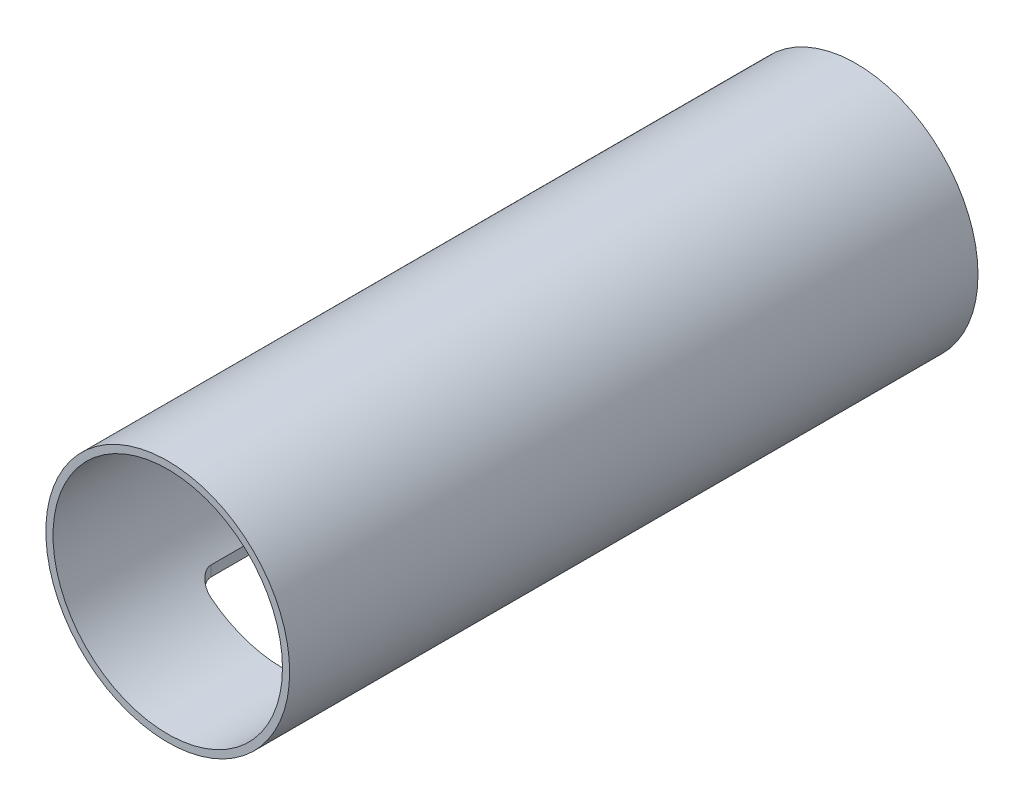
ISO-10303-21;
HEADER;
FILE_DESCRIPTION(('STEP AP214'),'2;1');
FILE_NAME('part.step','',(''),(''),'','','');
FILE_SCHEMA(('AUTOMOTIVE_DESIGN { 1 0 10303 214 1 1 1 1 }'));
ENDSEC;
DATA;
#1=APPLICATION_CONTEXT('core data for automotive mechanical design processes');
#2=APPLICATION_PROTOCOL_DEFINITION('international standard','automotive_design',2000,#1);
#3=PRODUCT_CONTEXT('',#1,'mechanical');
#4=PRODUCT('Part','Part','',(#3));
#5=PRODUCT_RELATED_PRODUCT_CATEGORY('part','',(#4));
#6=PRODUCT_DEFINITION_FORMATION('','',#4);
#7=PRODUCT_DEFINITION_CONTEXT('part definition',#1,'design');
#8=PRODUCT_DEFINITION('design','',#6,#7);
#9=PRODUCT_DEFINITION_SHAPE('','',#8);
#10=(LENGTH_UNIT() NAMED_UNIT(*) SI_UNIT(.MILLI.,.METRE.));
#11=(NAMED_UNIT(*) PLANE_ANGLE_UNIT() SI_UNIT($,.RADIAN.));
#12=(NAMED_UNIT(*) SI_UNIT($,.STERADIAN.) SOLID_ANGLE_UNIT());
#13=UNCERTAINTY_MEASURE_WITH_UNIT(LENGTH_MEASURE(1.E-05),#10,'distance_accuracy_value','');
#14=(GEOMETRIC_REPRESENTATION_CONTEXT(3) GLOBAL_UNCERTAINTY_ASSIGNED_CONTEXT((#13)) GLOBAL_UNIT_ASSIGNED_CONTEXT((#10,
#11,#12)) REPRESENTATION_CONTEXT('',''));
#15=CARTESIAN_POINT('',(0.,0.,0.));
#16=DIRECTION('',(0.,0.,1.));
#17=DIRECTION('',(1.,0.,0.));
#18=AXIS2_PLACEMENT_3D('',#15,#16,#17);
#19=CARTESIAN_POINT('',(0.,0.,304.8));
#20=DIRECTION('',(0.,0.,1.));
#21=DIRECTION('',(1.,0.,0.));
#22=AXIS2_PLACEMENT_3D('',#19,#20,#21);
#23=PLANE('',#22);
#24=CARTESIAN_POINT('',(0.,0.,304.8));
#25=DIRECTION('',(0.,0.,1.));
#26=DIRECTION('',(1.,0.,0.));
#27=AXIS2_PLACEMENT_3D('',#24,#25,#26);
#28=CIRCLE('',#27,53.975);
#29=CARTESIAN_POINT('',(53.975,0.,304.8));
#30=VERTEX_POINT('',#29);
#31=EDGE_CURVE('E138',#30,#30,#28,.T.);
#32=ORIENTED_EDGE('',*,*,#31,.T.);
#33=EDGE_LOOP('',(#32));
#34=FACE_BOUND('',#33,.T.);
#35=CARTESIAN_POINT('',(0.,0.,304.8));
#36=DIRECTION('',(0.,0.,1.));
#37=DIRECTION('',(1.,0.,0.));
#38=AXIS2_PLACEMENT_3D('',#35,#36,#37);
#39=CIRCLE('',#38,50.8);
#40=CARTESIAN_POINT('',(50.8,0.,304.8));
#41=VERTEX_POINT('',#40);
#42=EDGE_CURVE('E222',#41,#41,#39,.T.);
#43=ORIENTED_EDGE('',*,*,#42,.F.);
#44=EDGE_LOOP('',(#43));
#45=FACE_BOUND('',#44,.T.);
#46=ADVANCED_FACE('F34',(#34,#45),#23,.T.);
#47=CARTESIAN_POINT('',(0.,0.,0.));
#48=DIRECTION('',(0.,0.,1.));
#49=DIRECTION('',(1.,0.,0.));
#50=AXIS2_PLACEMENT_3D('',#47,#48,#49);
#51=PLANE('',#50);
#52=CARTESIAN_POINT('',(0.,0.,0.));
#53=DIRECTION('',(0.,0.,1.));
#54=DIRECTION('',(1.,0.,0.));
#55=AXIS2_PLACEMENT_3D('',#52,#53,#54);
#56=CIRCLE('',#55,53.975);
#57=CARTESIAN_POINT('',(53.975,0.,0.));
#58=VERTEX_POINT('',#57);
#59=EDGE_CURVE('E223',#58,#58,#56,.T.);
#60=ORIENTED_EDGE('',*,*,#59,.F.);
#61=EDGE_LOOP('',(#60));
#62=FACE_BOUND('',#61,.T.);
#63=CARTESIAN_POINT('',(0.,0.,0.));
#64=DIRECTION('',(0.,0.,1.));
#65=DIRECTION('',(1.,0.,0.));
#66=AXIS2_PLACEMENT_3D('',#63,#64,#65);
#67=CIRCLE('',#66,50.8);
#68=CARTESIAN_POINT('',(50.8,0.,0.));
#69=VERTEX_POINT('',#68);
#70=EDGE_CURVE('E224',#69,#69,#67,.T.);
#71=ORIENTED_EDGE('',*,*,#70,.T.);
#72=EDGE_LOOP('',(#71));
#73=FACE_BOUND('',#72,.T.);
#74=ADVANCED_FACE('F211',(#62,#73),#51,.F.);
#75=CARTESIAN_POINT('',(0.,0.,304.8));
#76=DIRECTION('',(0.,0.,-1.));
#77=DIRECTION('',(-1.,0.,0.));
#78=AXIS2_PLACEMENT_3D('',#75,#76,#77);
#79=CYLINDRICAL_SURFACE('',#78,53.975);
#80=CARTESIAN_POINT('',(0.,0.,50.8000000000001));
#81=DIRECTION('',(0.,0.,-1.));
#82=DIRECTION('',(-1.,0.,0.));
#83=AXIS2_PLACEMENT_3D('',#80,#81,#82);
#84=CIRCLE('',#83,53.975);
#85=CARTESIAN_POINT('',(31.75,-43.6490334944544,50.8000000000001));
#86=VERTEX_POINT('',#85);
#87=CARTESIAN_POINT('',(-31.75,-43.6490334944544,50.8000000000001));
#88=VERTEX_POINT('',#87);
#89=EDGE_CURVE('E234',#86,#88,#84,.T.);
#90=ORIENTED_EDGE('',*,*,#89,.T.);
#91=CARTESIAN_POINT('',(-31.75,-43.6490334944544,50.8));
#92=CARTESIAN_POINT('',(-31.9671645661144,-43.4910917308057,50.8000216077264));
#93=CARTESIAN_POINT('',(-32.1830925145013,-43.3315278911688,50.811139479836));
#94=CARTESIAN_POINT('',(-32.6111249146636,-43.0103037310794,50.8549774570421));
#95=CARTESIAN_POINT('',(-32.8232298792479,-42.8486436968849,50.8876946423517));
#96=CARTESIAN_POINT('',(-33.2437447895052,-42.5232331905489,50.9744340371832));
#97=CARTESIAN_POINT('',(-33.4521199770237,-42.3594759758144,51.0285990504604));
#98=CARTESIAN_POINT('',(-33.8624711897564,-42.0321605532084,51.1578179025464));
#99=CARTESIAN_POINT('',(-34.0644468526717,-41.8686023571062,51.2328729216642));
#100=CARTESIAN_POINT('',(-34.4673497143272,-41.5376050337947,51.4064635184477));
#101=CARTESIAN_POINT('',(-34.6680199253715,-41.3702171243803,51.5056953499271));
#102=CARTESIAN_POINT('',(-35.0598324520226,-41.0386968524416,51.7261587001272));
#103=CARTESIAN_POINT('',(-35.2509731508812,-40.8745650451624,51.8473939357979));
#104=CARTESIAN_POINT('',(-35.6216386096222,-40.5519380282734,52.111687528119));
#105=CARTESIAN_POINT('',(-35.8011910061636,-40.3934298472429,52.2546910078577));
#106=CARTESIAN_POINT('',(-36.1471608727121,-40.0841270359284,52.562938479448));
#107=CARTESIAN_POINT('',(-36.3135857324214,-39.9333280830646,52.7281698150887));
#108=CARTESIAN_POINT('',(-36.6758913633774,-39.60120728943,53.1311957176408));
#109=CARTESIAN_POINT('',(-36.8668581610706,-39.4232580835826,53.3763178108511));
#110=CARTESIAN_POINT('',(-37.2167246786667,-39.0931430945875,53.9038691724948));
#111=CARTESIAN_POINT('',(-37.3756708051428,-38.9409400504032,54.1862434551336));
#112=CARTESIAN_POINT('',(-37.6257075079159,-38.6992370330144,54.7274202416167));
#113=CARTESIAN_POINT('',(-37.7239957602517,-38.6032921010763,54.9799297821577));
#114=CARTESIAN_POINT('',(-37.8477480630419,-38.4818387987985,55.3726906002013));
#115=CARTESIAN_POINT('',(-37.8850366342113,-38.4451139238638,55.5058582652999));
#116=CARTESIAN_POINT('',(-37.951172153656,-38.3798295299991,55.7762032417029));
#117=CARTESIAN_POINT('',(-37.9800216810565,-38.3512675164117,55.9133793138388));
#118=CARTESIAN_POINT('',(-38.035822860446,-38.2959372490509,56.2313274180158));
#119=CARTESIAN_POINT('',(-38.0597797067801,-38.272109163351,56.4131706038523));
#120=CARTESIAN_POINT('',(-38.0838524214805,-38.2481492512502,56.6881164252345));
#121=CARTESIAN_POINT('',(-38.0898996821915,-38.2421261791923,56.7802579288836));
#122=CARTESIAN_POINT('',(-38.0979755055309,-38.2340804106997,56.9649238820445));
#123=CARTESIAN_POINT('',(-38.1000026230615,-38.2320591527749,57.0574484572851));
#124=CARTESIAN_POINT('',(-38.1,-38.2320627876655,57.15));
#125=B_SPLINE_CURVE_WITH_KNOTS('',3,(#91,#92,#93,#94,#95,#96,#97,#98,#99,#100,#101,#102,#103,
#104,#105,#106,#107,#108,#109,#110,#111,#112,#113,#114,#115,#116,#117,#118,#119,#120,#121,#122,
#123,#124),.UNSPECIFIED.,.F.,.F.,(4,2,2,2,2,2,2,2,2,2,2,2,2,2,2,2,4),(0.,0.805275273504928,
1.61044171248846,2.42106176295075,3.23172762366717,4.06928252124005,4.90697903563903,
5.7425976918702,6.5777425573036,7.64821365635678,8.71712201353948,9.57572456278142,
10.0045038518434,10.4331519609197,10.9865255927097,11.2639835586967,11.5415412428478),.UNSPECIFIED.);
#126=CARTESIAN_POINT('',(-38.1,-38.2320627876655,57.1500000000001));
#127=VERTEX_POINT('',#126);
#128=EDGE_CURVE('E11',#88,#127,#125,.T.);
#129=ORIENTED_EDGE('',*,*,#128,.T.);
#130=DIRECTION('',(0.,0.,-1.));
#131=VECTOR('',#130,1.);
#132=CARTESIAN_POINT('',(-38.1,-38.2320627876655,304.8));
#133=LINE('',#132,#131);
#134=CARTESIAN_POINT('',(-38.1,-38.2320627876655,247.65));
#135=VERTEX_POINT('',#134);
#136=EDGE_CURVE('E228',#127,#135,#133,.F.);
#137=ORIENTED_EDGE('',*,*,#136,.T.);
#138=CARTESIAN_POINT('',(-38.1,-38.2320627876655,247.65));
#139=CARTESIAN_POINT('',(-38.1000382770628,-38.2320169530965,247.794541857856));
#140=CARTESIAN_POINT('',(-38.0950665780027,-38.236979021492,247.939054374624));
#141=CARTESIAN_POINT('',(-38.0753949850665,-38.2565715916776,248.226626883022));
#142=CARTESIAN_POINT('',(-38.0607040264387,-38.2711932130922,248.369688086357));
#143=CARTESIAN_POINT('',(-38.0220643196317,-38.3095802338983,248.651922136953));
#144=CARTESIAN_POINT('',(-37.9982025041797,-38.3332597616007,248.791118716198));
#145=CARTESIAN_POINT('',(-37.9417039591621,-38.3891822381706,249.065974786895));
#146=CARTESIAN_POINT('',(-37.9090656790686,-38.4214267001828,249.201633648693));
#147=CARTESIAN_POINT('',(-37.8357390247491,-38.4936372370924,249.468048533763));
#148=CARTESIAN_POINT('',(-37.7950814684078,-38.5335737382822,249.598821115037));
#149=CARTESIAN_POINT('',(-37.7062667618409,-38.6204858789274,249.855410542855));
#150=CARTESIAN_POINT('',(-37.6581067608095,-38.667464193899,249.981225482712));
#151=CARTESIAN_POINT('',(-37.5031498287765,-38.8179746251297,250.35097021472));
#152=CARTESIAN_POINT('',(-37.3859957419796,-38.9309633535493,250.586775999815));
#153=CARTESIAN_POINT('',(-37.0727839964799,-39.2297575203872,251.132565488227));
#154=CARTESIAN_POINT('',(-36.8646109386839,-39.4258146193009,251.429974593068));
#155=CARTESIAN_POINT('',(-36.5258494817987,-39.7389859496975,251.838702022892));
#156=CARTESIAN_POINT('',(-36.4083340851252,-39.8467168962169,251.968864914241));
#157=CARTESIAN_POINT('',(-36.1653921246862,-40.0673417169261,252.21693795718));
#158=CARTESIAN_POINT('',(-36.0399655758661,-40.1802355813622,252.334848131915));
#159=CARTESIAN_POINT('',(-35.7447644517963,-40.4433188981975,252.590935323946));
#160=CARTESIAN_POINT('',(-35.5726735782206,-40.5948334121853,252.725079824535));
#161=CARTESIAN_POINT('',(-35.2184863154366,-40.9024928073588,252.973429078671));
#162=CARTESIAN_POINT('',(-35.0363868744688,-41.0586390940846,253.087627705585));
#163=CARTESIAN_POINT('',(-34.6635719413331,-41.3738680925609,253.296167252944));
#164=CARTESIAN_POINT('',(-34.4728565563142,-41.5329507677795,253.390508420257));
#165=CARTESIAN_POINT('',(-34.084122084474,-41.8525586424295,253.559254110345));
#166=CARTESIAN_POINT('',(-33.8861045704045,-42.0130835256655,253.633662898005));
#167=CARTESIAN_POINT('',(-33.3739385983665,-42.4221487919438,253.797508243403));
#168=CARTESIAN_POINT('',(-33.0553545344675,-42.670943179676,253.873007426998));
#169=CARTESIAN_POINT('',(-32.5702959767235,-43.0408860969665,253.948914710793));
#170=CARTESIAN_POINT('',(-32.407620804,-43.1635074987995,253.967992930485));
#171=CARTESIAN_POINT('',(-32.0802158961627,-43.4073964917723,253.99353062061));
#172=CARTESIAN_POINT('',(-31.9154856514069,-43.5286637323693,253.999986895675));
#173=CARTESIAN_POINT('',(-31.75,-43.6490334944544,254.));
#174=B_SPLINE_CURVE_WITH_KNOTS('',3,(#138,#139,#140,#141,#142,#143,#144,#145,#146,#147,#148,
#149,#150,#151,#152,#153,#154,#155,#156,#157,#158,#159,#160,#161,#162,#163,#164,#165,#166,#167,
#168,#169,#170,#171,#172,#173),.UNSPECIFIED.,.F.,.F.,(4,2,2,2,2,2,2,2,2,2,2,2,2,2,2,2,2,4),(0.,
0.433408619257567,0.866419343783104,1.29542284801707,1.72450219365589,2.15196364405273,
2.57958792077542,3.43619017286532,4.666859625735,5.28387485382069,5.90088891630378,
6.69675567879874,7.49286647376928,8.28896737090108,9.08489779186841,10.3149262051828,
10.9284065584759,11.5420422001802),.UNSPECIFIED.);
#175=CARTESIAN_POINT('',(-31.75,-43.6490334944544,254.));
#176=VERTEX_POINT('',#175);
#177=EDGE_CURVE('E188',#135,#176,#174,.T.);
#178=ORIENTED_EDGE('',*,*,#177,.T.);
#179=CARTESIAN_POINT('',(0.,0.,254.));
#180=DIRECTION('',(0.,0.,1.));
#181=DIRECTION('',(1.,0.,0.));
#182=AXIS2_PLACEMENT_3D('',#179,#180,#181);
#183=CIRCLE('',#182,53.975);
#184=CARTESIAN_POINT('',(31.75,-43.6490334944544,254.));
#185=VERTEX_POINT('',#184);
#186=EDGE_CURVE('E237',#176,#185,#183,.T.);
#187=ORIENTED_EDGE('',*,*,#186,.T.);
#188=CARTESIAN_POINT('',(31.75,-43.6490334944544,254.));
#189=CARTESIAN_POINT('',(31.9671645661144,-43.4910917308057,253.999978392274));
#190=CARTESIAN_POINT('',(32.1830925145013,-43.3315278911688,253.988860520164));
#191=CARTESIAN_POINT('',(32.6111249146636,-43.0103037310794,253.945022542958));
#192=CARTESIAN_POINT('',(32.8232298792479,-42.8486436968849,253.912305357648));
#193=CARTESIAN_POINT('',(33.2437447895052,-42.5232331905489,253.825565962817));
#194=CARTESIAN_POINT('',(33.4521199770237,-42.3594759758144,253.77140094954));
#195=CARTESIAN_POINT('',(33.8624711897564,-42.0321605532084,253.642182097454));
#196=CARTESIAN_POINT('',(34.0644468526717,-41.8686023571062,253.567127078336));
#197=CARTESIAN_POINT('',(34.4673497143272,-41.5376050337947,253.393536481552));
#198=CARTESIAN_POINT('',(34.6680199253715,-41.3702171243803,253.294304650073));
#199=CARTESIAN_POINT('',(35.0598324520226,-41.0386968524416,253.073841299873));
#200=CARTESIAN_POINT('',(35.2509731508812,-40.8745650451624,252.952606064202));
#201=CARTESIAN_POINT('',(35.6216386096221,-40.5519380282734,252.688312471881));
#202=CARTESIAN_POINT('',(35.8011910061636,-40.393429847243,252.545308992142));
#203=CARTESIAN_POINT('',(36.1471608727121,-40.0841270359285,252.237061520552));
#204=CARTESIAN_POINT('',(36.3135857324214,-39.9333280830647,252.071830184911));
#205=CARTESIAN_POINT('',(36.6758913633774,-39.60120728943,251.668804282359));
#206=CARTESIAN_POINT('',(36.8668581610706,-39.4232580835826,251.423682189149));
#207=CARTESIAN_POINT('',(37.2167246786667,-39.0931430945875,250.896130827505));
#208=CARTESIAN_POINT('',(37.3756708051428,-38.9409400504032,250.613756544866));
#209=CARTESIAN_POINT('',(37.6257075079159,-38.6992370330144,250.072579758383));
#210=CARTESIAN_POINT('',(37.7239957602517,-38.6032921010763,249.820070217842));
#211=CARTESIAN_POINT('',(37.8477480630419,-38.4818387987985,249.427309399799));
#212=CARTESIAN_POINT('',(37.8850366342113,-38.4451139238638,249.2941417347));
#213=CARTESIAN_POINT('',(37.951172153656,-38.3798295299991,249.023796758297));
#214=CARTESIAN_POINT('',(37.9800216810565,-38.3512675164117,248.886620686161));
#215=CARTESIAN_POINT('',(38.035822860446,-38.2959372490509,248.568672581984));
#216=CARTESIAN_POINT('',(38.0597797067801,-38.272109163351,248.386829396148));
#217=CARTESIAN_POINT('',(38.0838524214805,-38.2481492512502,248.111883574765));
#218=CARTESIAN_POINT('',(38.0898996821915,-38.2421261791923,248.019742071116));
#219=CARTESIAN_POINT('',(38.0979755055309,-38.2340804106997,247.835076117955));
#220=CARTESIAN_POINT('',(38.1000026230615,-38.2320591527749,247.742551542715));
#221=CARTESIAN_POINT('',(38.1,-38.2320627876655,247.65));
#222=B_SPLINE_CURVE_WITH_KNOTS('',3,(#188,#189,#190,#191,#192,#193,#194,#195,#196,#197,#198,
#199,#200,#201,#202,#203,#204,#205,#206,#207,#208,#209,#210,#211,#212,#213,#214,#215,#216,#217,
#218,#219,#220,#221),.UNSPECIFIED.,.F.,.F.,(4,2,2,2,2,2,2,2,2,2,2,2,2,2,2,2,4),(0.,
0.80527527350493,1.61044171248846,2.42106176295074,3.23172762366718,4.06928252124007,
4.906979035639,5.74259769187017,6.57774255730358,7.64821365635679,8.71712201353949,
9.57572456278146,10.0045038518434,10.4331519609197,10.9865255927097,11.2639835586967,
11.5415412428478),.UNSPECIFIED.);
#223=CARTESIAN_POINT('',(38.1,-38.2320627876655,247.65));
#224=VERTEX_POINT('',#223);
#225=EDGE_CURVE('E115',#185,#224,#222,.T.);
#226=ORIENTED_EDGE('',*,*,#225,.T.);
#227=DIRECTION('',(0.,0.,-1.));
#228=VECTOR('',#227,1.);
#229=CARTESIAN_POINT('',(38.1,-38.2320627876655,304.8));
#230=LINE('',#229,#228);
#231=CARTESIAN_POINT('',(38.1,-38.2320627876655,57.1500000000001));
#232=VERTEX_POINT('',#231);
#233=EDGE_CURVE('E124',#224,#232,#230,.T.);
#234=ORIENTED_EDGE('',*,*,#233,.T.);
#235=CARTESIAN_POINT('',(38.1,-38.2320627876655,57.15));
#236=CARTESIAN_POINT('',(38.1000382770628,-38.2320169530965,57.0054581421438));
#237=CARTESIAN_POINT('',(38.0950665780027,-38.236979021492,56.8609456253765));
#238=CARTESIAN_POINT('',(38.0753949850665,-38.2565715916777,56.5733731169783));
#239=CARTESIAN_POINT('',(38.0607040264387,-38.2711932130922,56.4303119136433));
#240=CARTESIAN_POINT('',(38.0220643196317,-38.3095802338983,56.1480778630466));
#241=CARTESIAN_POINT('',(37.9982025041797,-38.3332597616007,56.0088812838024));
#242=CARTESIAN_POINT('',(37.9417039591621,-38.3891822381706,55.7340252131054));
#243=CARTESIAN_POINT('',(37.9090656790686,-38.4214267001828,55.5983663513072));
#244=CARTESIAN_POINT('',(37.8357390247491,-38.4936372370924,55.3319514662366));
#245=CARTESIAN_POINT('',(37.7950814684077,-38.5335737382823,55.2011788849627));
#246=CARTESIAN_POINT('',(37.7062667618409,-38.6204858789274,54.9445894571452));
#247=CARTESIAN_POINT('',(37.6581067608095,-38.667464193899,54.818774517288));
#248=CARTESIAN_POINT('',(37.5031498287765,-38.8179746251297,54.4490297852796));
#249=CARTESIAN_POINT('',(37.3859957419796,-38.9309633535493,54.2132240001851));
#250=CARTESIAN_POINT('',(37.0727839964799,-39.2297575203873,53.6674345117732));
#251=CARTESIAN_POINT('',(36.8646109386838,-39.4258146193009,53.3700254069317));
#252=CARTESIAN_POINT('',(36.5258494817987,-39.7389859496975,52.9612979771084));
#253=CARTESIAN_POINT('',(36.4083340851251,-39.8467168962169,52.831135085759));
#254=CARTESIAN_POINT('',(36.1653921246861,-40.0673417169261,52.5830620428205));
#255=CARTESIAN_POINT('',(36.0399655758661,-40.1802355813623,52.4651518680852));
#256=CARTESIAN_POINT('',(35.7447644517963,-40.4433188981976,52.2090646760537));
#257=CARTESIAN_POINT('',(35.5726735782206,-40.5948334121854,52.0749201754649));
#258=CARTESIAN_POINT('',(35.2184863154365,-40.9024928073588,51.8265709213293));
#259=CARTESIAN_POINT('',(35.0363868744688,-41.0586390940846,51.7123722944153));
#260=CARTESIAN_POINT('',(34.663571941333,-41.373868092561,51.5038327470564));
#261=CARTESIAN_POINT('',(34.4728565563142,-41.5329507677795,51.4094915797435));
#262=CARTESIAN_POINT('',(34.0841220844739,-41.8525586424295,51.2407458896551));
#263=CARTESIAN_POINT('',(33.8861045704044,-42.0130835256656,51.1663371019948));
#264=CARTESIAN_POINT('',(33.3739385983665,-42.4221487919438,51.0024917565969));
#265=CARTESIAN_POINT('',(33.0553545344674,-42.670943179676,50.9269925730018));
#266=CARTESIAN_POINT('',(32.5702959767235,-43.0408860969665,50.8510852892067));
#267=CARTESIAN_POINT('',(32.407620804,-43.1635074987996,50.8320070695147));
#268=CARTESIAN_POINT('',(32.0802158961627,-43.4073964917723,50.8064693793897));
#269=CARTESIAN_POINT('',(31.9154856514069,-43.5286637323693,50.8000131043246));
#270=CARTESIAN_POINT('',(31.75,-43.6490334944544,50.8));
#271=B_SPLINE_CURVE_WITH_KNOTS('',3,(#235,#236,#237,#238,#239,#240,#241,#242,#243,#244,#245,
#246,#247,#248,#249,#250,#251,#252,#253,#254,#255,#256,#257,#258,#259,#260,#261,#262,#263,#264,
#265,#266,#267,#268,#269,#270),.UNSPECIFIED.,.F.,.F.,(4,2,2,2,2,2,2,2,2,2,2,2,2,2,2,2,2,4),(0.,
0.433408619257568,0.866419343783105,1.29542284801709,1.7245021936559,2.15196364405277,
2.57958792077546,3.43619017286534,4.66685962573505,5.28387485382075,5.90088891630384,
6.69675567879883,7.49286647376936,8.28896737090116,9.08489779186847,10.3149262051828,
10.9284065584759,11.5420422001802),.UNSPECIFIED.);
#272=EDGE_CURVE('E61',#232,#86,#271,.T.);
#273=ORIENTED_EDGE('',*,*,#272,.T.);
#274=EDGE_LOOP('',(#90,#129,#137,#178,#187,#226,#234,#273));
#275=FACE_BOUND('',#274,.T.);
#276=ORIENTED_EDGE('',*,*,#31,.F.);
#277=EDGE_LOOP('',(#276));
#278=FACE_BOUND('',#277,.T.);
#279=ORIENTED_EDGE('',*,*,#59,.T.);
#280=EDGE_LOOP('',(#279));
#281=FACE_BOUND('',#280,.T.);
#282=ADVANCED_FACE('F172',(#275,#278,#281),#79,.T.);
#283=CARTESIAN_POINT('',(0.,0.,304.8));
#284=DIRECTION('',(0.,0.,-1.));
#285=DIRECTION('',(-1.,0.,0.));
#286=AXIS2_PLACEMENT_3D('',#283,#284,#285);
#287=CYLINDRICAL_SURFACE('',#286,50.8);
#288=DIRECTION('',(0.,0.,-1.));
#289=VECTOR('',#288,1.);
#290=CARTESIAN_POINT('',(-38.1,-33.6010416505203,304.8));
#291=LINE('',#290,#289);
#292=CARTESIAN_POINT('',(-38.1,-33.6010416505203,57.1500000000001));
#293=VERTEX_POINT('',#292);
#294=CARTESIAN_POINT('',(-38.1,-33.6010416505203,247.65));
#295=VERTEX_POINT('',#294);
#296=EDGE_CURVE('E136',#293,#295,#291,.F.);
#297=ORIENTED_EDGE('',*,*,#296,.F.);
#298=CARTESIAN_POINT('',(-38.1,-33.6010416505203,57.15));
#299=CARTESIAN_POINT('',(-38.1000406598018,-33.6009869081376,57.0104119463914));
#300=CARTESIAN_POINT('',(-38.0953991803042,-33.6062583467925,56.8708597488577));
#301=CARTESIAN_POINT('',(-38.0770641578235,-33.6270357020001,56.5932734617144));
#302=CARTESIAN_POINT('',(-38.0633809600721,-33.6425299219573,56.4552378201966));
#303=CARTESIAN_POINT('',(-38.0274676797327,-33.68311715537,56.1832773634198));
#304=CARTESIAN_POINT('',(-38.0053311464691,-33.7081050912095,56.0493242970236));
#305=CARTESIAN_POINT('',(-37.9530142038416,-33.7669997381014,55.7849849005502));
#306=CARTESIAN_POINT('',(-37.9228319679643,-33.8009084743066,55.6545993877897));
#307=CARTESIAN_POINT('',(-37.8551858928097,-33.8766506514693,55.3988212192314));
#308=CARTESIAN_POINT('',(-37.8177570955079,-33.918445931957,55.2734079017327));
#309=CARTESIAN_POINT('',(-37.7361546720023,-34.0092098249464,55.0274407994166));
#310=CARTESIAN_POINT('',(-37.6919783567841,-34.0581812969798,54.9068889763154));
#311=CARTESIAN_POINT('',(-37.5500645608315,-34.2148000053426,54.5525865622289));
#312=CARTESIAN_POINT('',(-37.4430837424623,-34.331991831049,54.3267085882037));
#313=CARTESIAN_POINT('',(-37.1492356380696,-34.6502756704295,53.787320131822));
#314=CARTESIAN_POINT('',(-36.949495973179,-34.8636215701241,53.4880821817808));
#315=CARTESIAN_POINT('',(-36.6245837891696,-35.2037631152799,53.0767240103862));
#316=CARTESIAN_POINT('',(-36.5118780495866,-35.3206843459317,52.9456893565266));
#317=CARTESIAN_POINT('',(-36.2789197642108,-35.5599177510912,52.6957266954824));
#318=CARTESIAN_POINT('',(-36.1586673656259,-35.6822298204295,52.5767984522645));
#319=CARTESIAN_POINT('',(-35.8668335495508,-35.9759255210748,52.3099388643557));
#320=CARTESIAN_POINT('',(-35.6924069794547,-36.1490695524525,52.1670574015661));
#321=CARTESIAN_POINT('',(-35.3328891549579,-36.5005506052173,51.9025995889068));
#322=CARTESIAN_POINT('',(-35.1477939515414,-36.6788895372681,51.7810311962847));
#323=CARTESIAN_POINT('',(-34.7683536398644,-37.0387630703524,51.5589026503958));
#324=CARTESIAN_POINT('',(-34.5740081301443,-37.2202978098668,51.45834340994));
#325=CARTESIAN_POINT('',(-34.1772975018021,-37.5849023697482,51.2781887206875));
#326=CARTESIAN_POINT('',(-33.9749342002723,-37.7679718349651,51.1985885527961));
#327=CARTESIAN_POINT('',(-33.6076165834917,-38.0948143456854,51.0753993827118));
#328=CARTESIAN_POINT('',(-33.4439880421995,-38.2385622400757,51.0277469851812));
#329=CARTESIAN_POINT('',(-33.1130226269049,-38.5255200562304,50.9456685011777));
#330=CARTESIAN_POINT('',(-32.9456864048831,-38.6687300674803,50.9112401085356));
#331=CARTESIAN_POINT('',(-32.6083859485905,-38.953583726373,50.8559714145103));
#332=CARTESIAN_POINT('',(-32.438431680096,-39.0952308919463,50.8350885537225));
#333=CARTESIAN_POINT('',(-32.0959654340088,-39.3768761859128,50.8071066367267));
#334=CARTESIAN_POINT('',(-31.9234527621302,-39.5168738474671,50.8000113937437));
#335=CARTESIAN_POINT('',(-31.75,-39.6557372898298,50.8));
#336=B_SPLINE_CURVE_WITH_KNOTS('',3,(#298,#299,#300,#301,#302,#303,#304,#305,#306,#307,#308,
#309,#310,#311,#312,#313,#314,#315,#316,#317,#318,#319,#320,#321,#322,#323,#324,#325,#326,#327,
#328,#329,#330,#331,#332,#333,#334,#335),.UNSPECIFIED.,.F.,.F.,(4,2,2,2,2,2,2,2,2,2,2,2,2,2,2,2,
2,2,4),(0.,0.41853081725498,0.83658359278978,1.25013809039292,1.66378655207584,2.07548257139449,
2.48734308957401,3.31273078572717,4.56030197386282,5.1859314295374,5.8115486852558,
6.66324632877514,7.51526128008215,8.3673132422582,9.21917319408092,9.88763520133934,
10.5559805807577,11.222215747073,11.8886351470419),.UNSPECIFIED.);
#337=CARTESIAN_POINT('',(-31.75,-39.6557372898298,50.8000000000001));
#338=VERTEX_POINT('',#337);
#339=EDGE_CURVE('E47',#293,#338,#336,.T.);
#340=ORIENTED_EDGE('',*,*,#339,.T.);
#341=CARTESIAN_POINT('',(0.,0.,50.8000000000001));
#342=DIRECTION('',(0.,0.,-1.));
#343=DIRECTION('',(-1.,0.,0.));
#344=AXIS2_PLACEMENT_3D('',#341,#342,#343);
#345=CIRCLE('',#344,50.8);
#346=CARTESIAN_POINT('',(31.75,-39.6557372898298,50.8000000000001));
#347=VERTEX_POINT('',#346);
#348=EDGE_CURVE('E133',#347,#338,#345,.T.);
#349=ORIENTED_EDGE('',*,*,#348,.F.);
#350=CARTESIAN_POINT('',(31.75,-39.6557372898298,50.8));
#351=CARTESIAN_POINT('',(31.9590739462342,-39.4883647972967,50.8000248658436));
#352=CARTESIAN_POINT('',(32.1667668880403,-39.3193443881602,50.8103249321687));
#353=CARTESIAN_POINT('',(32.578264539602,-38.9790649548654,50.8508500935444));
#354=CARTESIAN_POINT('',(32.7820701669574,-38.8078064754985,50.881070424999));
#355=CARTESIAN_POINT('',(33.1862032075829,-38.4628018645924,50.9610955552449));
#356=CARTESIAN_POINT('',(33.3864954718389,-38.2890467024258,51.0110384204821));
#357=CARTESIAN_POINT('',(33.7811438084499,-37.9413162345965,51.1300791425074));
#358=CARTESIAN_POINT('',(33.9754991433268,-37.7673409043576,51.1991793683434));
#359=CARTESIAN_POINT('',(34.379561196373,-37.4001162976156,51.365448084193));
#360=CARTESIAN_POINT('',(34.5884190262085,-37.2069824774528,51.4649484756108));
#361=CARTESIAN_POINT('',(34.9962016975795,-36.823690616445,51.6875230693191));
#362=CARTESIAN_POINT('',(35.1951240047019,-36.6335333432833,51.8106032481569));
#363=CARTESIAN_POINT('',(35.5809450406519,-36.2589083165116,52.0803228459742));
#364=CARTESIAN_POINT('',(35.7678724916899,-36.0744275677541,52.2269028024432));
#365=CARTESIAN_POINT('',(36.1281727065306,-35.713584557299,52.5443813838423));
#366=CARTESIAN_POINT('',(36.301554627455,-35.5372168447361,52.7152633556876));
#367=CARTESIAN_POINT('',(36.6636201851414,-35.1638807708422,53.1169951459155));
#368=CARTESIAN_POINT('',(36.8490378555192,-34.9692864791134,53.3530779932081));
#369=CARTESIAN_POINT('',(37.1912760139599,-34.6050760576298,53.862306004738));
#370=CARTESIAN_POINT('',(37.3481375385407,-34.4354241530911,54.1353969854628));
#371=CARTESIAN_POINT('',(37.5952398773284,-34.1652465068871,54.6560614148925));
#372=CARTESIAN_POINT('',(37.6925534287325,-34.0576998001352,54.8965217874098));
#373=CARTESIAN_POINT('',(37.8174041642832,-33.9188416008791,55.2720972117938));
#374=CARTESIAN_POINT('',(37.8554795254426,-33.8763237579173,55.3996639006394));
#375=CARTESIAN_POINT('',(37.9239879209593,-33.7996122425877,55.6592438032255));
#376=CARTESIAN_POINT('',(37.9544255052005,-33.7654136147708,55.7912543163283));
#377=CARTESIAN_POINT('',(38.0002032166696,-33.7138756755986,56.0240981144152));
#378=CARTESIAN_POINT('',(38.017411102255,-33.6944647689142,56.1241135797708));
#379=CARTESIAN_POINT('',(38.0470962486212,-33.6609412611629,56.325709393195));
#380=CARTESIAN_POINT('',(38.0595746030126,-33.6468274352584,56.4272893738402));
#381=CARTESIAN_POINT('',(38.0796826479832,-33.624068986723,56.632075181532));
#382=CARTESIAN_POINT('',(38.0872869768512,-33.6154529726595,56.7352866945201));
#383=CARTESIAN_POINT('',(38.0974533722556,-33.603929187115,56.9423289186182));
#384=CARTESIAN_POINT('',(38.1000127573037,-33.6010244512944,57.0461599296129));
#385=CARTESIAN_POINT('',(38.1,-33.6010416505203,57.15));
#386=B_SPLINE_CURVE_WITH_KNOTS('',3,(#350,#351,#352,#353,#354,#355,#356,#357,#358,#359,#360,
#361,#362,#363,#364,#365,#366,#367,#368,#369,#370,#371,#372,#373,#374,#375,#376,#377,#378,#379,
#380,#381,#382,#383,#384,#385),.UNSPECIFIED.,.F.,.F.,(4,2,2,2,2,2,2,2,2,2,2,2,2,2,2,2,2,4),(0.,
0.803173752990794,1.60615551014688,2.41486108095375,3.22366670299506,4.1266842710009,
5.02993102192464,5.9309273098551,6.83130913393457,7.90122737638919,8.96959574565017,
9.80854742330446,10.2273664390803,10.645935365588,10.9556765024261,11.265345973995,
11.5766139847273,11.8880473960564),.UNSPECIFIED.);
#387=CARTESIAN_POINT('',(38.1,-33.6010416505203,57.1500000000001));
#388=VERTEX_POINT('',#387);
#389=EDGE_CURVE('E132',#347,#388,#386,.T.);
#390=ORIENTED_EDGE('',*,*,#389,.T.);
#391=DIRECTION('',(0.,0.,-1.));
#392=VECTOR('',#391,1.);
#393=CARTESIAN_POINT('',(38.1,-33.6010416505203,304.8));
#394=LINE('',#393,#392);
#395=CARTESIAN_POINT('',(38.1,-33.6010416505203,247.65));
#396=VERTEX_POINT('',#395);
#397=EDGE_CURVE('E122',#396,#388,#394,.T.);
#398=ORIENTED_EDGE('',*,*,#397,.F.);
#399=CARTESIAN_POINT('',(38.1,-33.6010416505203,247.65));
#400=CARTESIAN_POINT('',(38.1000406598018,-33.6009869081376,247.789588053609));
#401=CARTESIAN_POINT('',(38.0953991803042,-33.6062583467925,247.929140251142));
#402=CARTESIAN_POINT('',(38.0770641578235,-33.6270357020001,248.206726538286));
#403=CARTESIAN_POINT('',(38.0633809600721,-33.6425299219573,248.344762179803));
#404=CARTESIAN_POINT('',(38.0274676797327,-33.68311715537,248.61672263658));
#405=CARTESIAN_POINT('',(38.0053311464691,-33.7081050912095,248.750675702976));
#406=CARTESIAN_POINT('',(37.9530142038416,-33.7669997381014,249.01501509945));
#407=CARTESIAN_POINT('',(37.9228319679643,-33.8009084743066,249.14540061221));
#408=CARTESIAN_POINT('',(37.8551858928097,-33.8766506514693,249.401178780769));
#409=CARTESIAN_POINT('',(37.8177570955079,-33.918445931957,249.526592098267));
#410=CARTESIAN_POINT('',(37.7361546720023,-34.0092098249464,249.772559200583));
#411=CARTESIAN_POINT('',(37.6919783567841,-34.0581812969798,249.893111023685));
#412=CARTESIAN_POINT('',(37.5500645608315,-34.2148000053426,250.247413437771));
#413=CARTESIAN_POINT('',(37.4430837424623,-34.331991831049,250.473291411796));
#414=CARTESIAN_POINT('',(37.1492356380696,-34.6502756704295,251.012679868178));
#415=CARTESIAN_POINT('',(36.949495973179,-34.8636215701241,251.311917818219));
#416=CARTESIAN_POINT('',(36.6245837891696,-35.2037631152799,251.723275989614));
#417=CARTESIAN_POINT('',(36.5118780495866,-35.3206843459317,251.854310643473));
#418=CARTESIAN_POINT('',(36.2789197642108,-35.5599177510912,252.104273304518));
#419=CARTESIAN_POINT('',(36.1586673656259,-35.6822298204295,252.223201547736));
#420=CARTESIAN_POINT('',(35.8668335495509,-35.9759255210747,252.490061135644));
#421=CARTESIAN_POINT('',(35.6924069794548,-36.1490695524525,252.632942598434));
#422=CARTESIAN_POINT('',(35.3328891549579,-36.5005506052172,252.897400411093));
#423=CARTESIAN_POINT('',(35.1477939515414,-36.6788895372681,253.018968803715));
#424=CARTESIAN_POINT('',(34.7683536398644,-37.0387630703524,253.241097349604));
#425=CARTESIAN_POINT('',(34.5740081301444,-37.2202978098668,253.34165659006));
#426=CARTESIAN_POINT('',(34.1772975018021,-37.5849023697482,253.521811279313));
#427=CARTESIAN_POINT('',(33.9749342002723,-37.7679718349651,253.601411447204));
#428=CARTESIAN_POINT('',(33.6076165834917,-38.0948143456854,253.724600617288));
#429=CARTESIAN_POINT('',(33.4439880421995,-38.2385622400757,253.772253014819));
#430=CARTESIAN_POINT('',(33.1130226269049,-38.5255200562304,253.854331498822));
#431=CARTESIAN_POINT('',(32.9456864048831,-38.6687300674803,253.888759891464));
#432=CARTESIAN_POINT('',(32.6083859485905,-38.953583726373,253.94402858549));
#433=CARTESIAN_POINT('',(32.438431680096,-39.0952308919463,253.964911446278));
#434=CARTESIAN_POINT('',(32.0959654340087,-39.3768761859128,253.992893363273));
#435=CARTESIAN_POINT('',(31.9234527621302,-39.5168738474671,253.999988606256));
#436=CARTESIAN_POINT('',(31.75,-39.6557372898298,254.));
#437=B_SPLINE_CURVE_WITH_KNOTS('',3,(#399,#400,#401,#402,#403,#404,#405,#406,#407,#408,#409,
#410,#411,#412,#413,#414,#415,#416,#417,#418,#419,#420,#421,#422,#423,#424,#425,#426,#427,#428,
#429,#430,#431,#432,#433,#434,#435,#436),.UNSPECIFIED.,.F.,.F.,(4,2,2,2,2,2,2,2,2,2,2,2,2,2,2,2,
2,2,4),(0.,0.418530817254987,0.836583592789786,1.25013809039293,1.66378655207584,
2.07548257139447,2.48734308957394,3.31273078572712,4.56030197386279,5.18593142953739,
5.81154868525576,6.6632463287751,7.51526128008214,8.36731324225818,9.21917319408091,
9.88763520133934,10.5559805807577,11.222215747073,11.8886351470419),.UNSPECIFIED.);
#438=CARTESIAN_POINT('',(31.75,-39.6557372898298,254.));
#439=VERTEX_POINT('',#438);
#440=EDGE_CURVE('E105',#396,#439,#437,.T.);
#441=ORIENTED_EDGE('',*,*,#440,.T.);
#442=CARTESIAN_POINT('',(0.,0.,254.));
#443=DIRECTION('',(0.,0.,1.));
#444=DIRECTION('',(1.,0.,0.));
#445=AXIS2_PLACEMENT_3D('',#442,#443,#444);
#446=CIRCLE('',#445,50.8);
#447=CARTESIAN_POINT('',(-31.75,-39.6557372898298,254.));
#448=VERTEX_POINT('',#447);
#449=EDGE_CURVE('E134',#448,#439,#446,.T.);
#450=ORIENTED_EDGE('',*,*,#449,.F.);
#451=CARTESIAN_POINT('',(-31.75,-39.6557372898298,254.));
#452=CARTESIAN_POINT('',(-31.9590739462343,-39.4883647972967,253.999975134156));
#453=CARTESIAN_POINT('',(-32.1667668880403,-39.3193443881602,253.989675067831));
#454=CARTESIAN_POINT('',(-32.578264539602,-38.9790649548654,253.949149906456));
#455=CARTESIAN_POINT('',(-32.7820701669574,-38.8078064754985,253.918929575001));
#456=CARTESIAN_POINT('',(-33.1862032075829,-38.4628018645923,253.838904444755));
#457=CARTESIAN_POINT('',(-33.3864954718389,-38.2890467024258,253.788961579518));
#458=CARTESIAN_POINT('',(-33.7811438084499,-37.9413162345965,253.669920857493));
#459=CARTESIAN_POINT('',(-33.9754991433268,-37.7673409043576,253.600820631657));
#460=CARTESIAN_POINT('',(-34.379561196373,-37.4001162976156,253.434551915807));
#461=CARTESIAN_POINT('',(-34.5884190262085,-37.2069824774528,253.335051524389));
#462=CARTESIAN_POINT('',(-34.9962016975795,-36.823690616445,253.112476930681));
#463=CARTESIAN_POINT('',(-35.1951240047019,-36.6335333432833,252.989396751843));
#464=CARTESIAN_POINT('',(-35.5809450406519,-36.2589083165116,252.719677154026));
#465=CARTESIAN_POINT('',(-35.7678724916899,-36.0744275677541,252.573097197557));
#466=CARTESIAN_POINT('',(-36.1281727065306,-35.713584557299,252.255618616158));
#467=CARTESIAN_POINT('',(-36.301554627455,-35.5372168447361,252.084736644312));
#468=CARTESIAN_POINT('',(-36.6636201851414,-35.1638807708422,251.683004854085));
#469=CARTESIAN_POINT('',(-36.8490378555192,-34.9692864791134,251.446922006792));
#470=CARTESIAN_POINT('',(-37.1912760139599,-34.6050760576298,250.937693995262));
#471=CARTESIAN_POINT('',(-37.3481375385407,-34.4354241530911,250.664603014537));
#472=CARTESIAN_POINT('',(-37.5952398773284,-34.1652465068871,250.143938585108));
#473=CARTESIAN_POINT('',(-37.6925534287325,-34.0576998001352,249.90347821259));
#474=CARTESIAN_POINT('',(-37.8174041642832,-33.9188416008791,249.527902788206));
#475=CARTESIAN_POINT('',(-37.8554795254426,-33.8763237579173,249.400336099361));
#476=CARTESIAN_POINT('',(-37.9239879209593,-33.7996122425877,249.140756196775));
#477=CARTESIAN_POINT('',(-37.9544255052005,-33.7654136147708,249.008745683672));
#478=CARTESIAN_POINT('',(-38.0002032166696,-33.7138756755986,248.775901885585));
#479=CARTESIAN_POINT('',(-38.017411102255,-33.6944647689141,248.675886420229));
#480=CARTESIAN_POINT('',(-38.0470962486212,-33.6609412611629,248.474290606805));
#481=CARTESIAN_POINT('',(-38.0595746030126,-33.6468274352584,248.37271062616));
#482=CARTESIAN_POINT('',(-38.0796826479832,-33.624068986723,248.167924818468));
#483=CARTESIAN_POINT('',(-38.0872869768512,-33.6154529726595,248.06471330548));
#484=CARTESIAN_POINT('',(-38.0974533722556,-33.603929187115,247.857671081382));
#485=CARTESIAN_POINT('',(-38.1000127573037,-33.6010244512944,247.753840070387));
#486=CARTESIAN_POINT('',(-38.1,-33.6010416505203,247.65));
#487=B_SPLINE_CURVE_WITH_KNOTS('',3,(#451,#452,#453,#454,#455,#456,#457,#458,#459,#460,#461,
#462,#463,#464,#465,#466,#467,#468,#469,#470,#471,#472,#473,#474,#475,#476,#477,#478,#479,#480,
#481,#482,#483,#484,#485,#486),.UNSPECIFIED.,.F.,.F.,(4,2,2,2,2,2,2,2,2,2,2,2,2,2,2,2,2,4),(0.,
0.80317375299079,1.60615551014688,2.41486108095375,3.22366670299506,4.12668427100091,
5.02993102192461,5.93092730985507,6.83130913393456,7.90122737638916,8.96959574565015,
9.80854742330448,10.2273664390803,10.6459353655879,10.9556765024261,11.265345973995,
11.5766139847273,11.8880473960564),.UNSPECIFIED.);
#488=EDGE_CURVE('E178',#448,#295,#487,.T.);
#489=ORIENTED_EDGE('',*,*,#488,.T.);
#490=EDGE_LOOP('',(#297,#340,#349,#390,#398,#441,#450,#489));
#491=FACE_BOUND('',#490,.T.);
#492=ORIENTED_EDGE('',*,*,#42,.T.);
#493=EDGE_LOOP('',(#492));
#494=FACE_BOUND('',#493,.T.);
#495=ORIENTED_EDGE('',*,*,#70,.F.);
#496=EDGE_LOOP('',(#495));
#497=FACE_BOUND('',#496,.T.);
#498=ADVANCED_FACE('F129',(#491,#494,#497),#287,.F.);
#499=CARTESIAN_POINT('',(-38.1,-53.975,50.8));
#500=DIRECTION('',(-1.,0.,0.));
#501=DIRECTION('',(0.,0.,1.));
#502=AXIS2_PLACEMENT_3D('',#499,#500,#501);
#503=PLANE('',#502);
#504=ORIENTED_EDGE('',*,*,#296,.T.);
#505=DIRECTION('',(0.,1.,0.));
#506=VECTOR('',#505,1.);
#507=CARTESIAN_POINT('',(-38.1,-38.2320627876655,247.65));
#508=LINE('',#507,#506);
#509=EDGE_CURVE('E151',#295,#135,#508,.F.);
#510=ORIENTED_EDGE('',*,*,#509,.T.);
#511=ORIENTED_EDGE('',*,*,#136,.F.);
#512=DIRECTION('',(0.,1.,0.));
#513=VECTOR('',#512,1.);
#514=CARTESIAN_POINT('',(-38.1,-33.6010416505203,57.15));
#515=LINE('',#514,#513);
#516=EDGE_CURVE('E148',#127,#293,#515,.T.);
#517=ORIENTED_EDGE('',*,*,#516,.T.);
#518=EDGE_LOOP('',(#504,#510,#511,#517));
#519=FACE_BOUND('',#518,.T.);
#520=ADVANCED_FACE('F171',(#519),#503,.F.);
#521=CARTESIAN_POINT('',(-38.1,-53.975,50.8));
#522=DIRECTION('',(0.,0.,-1.));
#523=DIRECTION('',(-1.,0.,0.));
#524=AXIS2_PLACEMENT_3D('',#521,#522,#523);
#525=PLANE('',#524);
#526=ORIENTED_EDGE('',*,*,#89,.F.);
#527=DIRECTION('',(0.,1.,0.));
#528=VECTOR('',#527,1.);
#529=CARTESIAN_POINT('',(31.75,-33.6010416505203,50.8));
#530=LINE('',#529,#528);
#531=EDGE_CURVE('E116',#86,#347,#530,.T.);
#532=ORIENTED_EDGE('',*,*,#531,.T.);
#533=ORIENTED_EDGE('',*,*,#348,.T.);
#534=DIRECTION('',(0.,1.,0.));
#535=VECTOR('',#534,1.);
#536=CARTESIAN_POINT('',(-31.75,-38.2320627876655,50.8));
#537=LINE('',#536,#535);
#538=EDGE_CURVE('E54',#338,#88,#537,.F.);
#539=ORIENTED_EDGE('',*,*,#538,.T.);
#540=EDGE_LOOP('',(#526,#532,#533,#539));
#541=FACE_BOUND('',#540,.T.);
#542=ADVANCED_FACE('F251',(#541),#525,.F.);
#543=CARTESIAN_POINT('',(38.1,-53.975,50.8));
#544=DIRECTION('',(1.,0.,0.));
#545=DIRECTION('',(0.,0.,-1.));
#546=AXIS2_PLACEMENT_3D('',#543,#544,#545);
#547=PLANE('',#546);
#548=ORIENTED_EDGE('',*,*,#233,.F.);
#549=DIRECTION('',(0.,1.,0.));
#550=VECTOR('',#549,1.);
#551=CARTESIAN_POINT('',(38.1,-33.6010416505203,247.65));
#552=LINE('',#551,#550);
#553=EDGE_CURVE('E109',#224,#396,#552,.T.);
#554=ORIENTED_EDGE('',*,*,#553,.T.);
#555=ORIENTED_EDGE('',*,*,#397,.T.);
#556=DIRECTION('',(0.,1.,0.));
#557=VECTOR('',#556,1.);
#558=CARTESIAN_POINT('',(38.1,-38.2320627876655,57.15));
#559=LINE('',#558,#557);
#560=EDGE_CURVE('E126',#388,#232,#559,.F.);
#561=ORIENTED_EDGE('',*,*,#560,.T.);
#562=EDGE_LOOP('',(#548,#554,#555,#561));
#563=FACE_BOUND('',#562,.T.);
#564=ADVANCED_FACE('F121',(#563),#547,.F.);
#565=CARTESIAN_POINT('',(-38.1,-53.975,254.));
#566=DIRECTION('',(0.,0.,1.));
#567=DIRECTION('',(1.,0.,0.));
#568=AXIS2_PLACEMENT_3D('',#565,#566,#567);
#569=PLANE('',#568);
#570=ORIENTED_EDGE('',*,*,#449,.T.);
#571=DIRECTION('',(0.,1.,0.));
#572=VECTOR('',#571,1.);
#573=CARTESIAN_POINT('',(31.75,-38.2320627876655,254.));
#574=LINE('',#573,#572);
#575=EDGE_CURVE('E110',#439,#185,#574,.F.);
#576=ORIENTED_EDGE('',*,*,#575,.T.);
#577=ORIENTED_EDGE('',*,*,#186,.F.);
#578=DIRECTION('',(0.,1.,0.));
#579=VECTOR('',#578,1.);
#580=CARTESIAN_POINT('',(-31.75,-33.6010416505203,254.));
#581=LINE('',#580,#579);
#582=EDGE_CURVE('E125',#176,#448,#581,.T.);
#583=ORIENTED_EDGE('',*,*,#582,.T.);
#584=EDGE_LOOP('',(#570,#576,#577,#583));
#585=FACE_BOUND('',#584,.T.);
#586=ADVANCED_FACE('F208',(#585),#569,.F.);
#587=CARTESIAN_POINT('',(31.75,-53.975,247.65));
#588=DIRECTION('',(0.,-1.,0.));
#589=DIRECTION('',(0.,0.,-1.));
#590=AXIS2_PLACEMENT_3D('',#587,#588,#589);
#591=CYLINDRICAL_SURFACE('',#590,6.35);
#592=ORIENTED_EDGE('',*,*,#225,.F.);
#593=ORIENTED_EDGE('',*,*,#575,.F.);
#594=ORIENTED_EDGE('',*,*,#440,.F.);
#595=ORIENTED_EDGE('',*,*,#553,.F.);
#596=EDGE_LOOP('',(#592,#593,#594,#595));
#597=FACE_BOUND('',#596,.T.);
#598=ADVANCED_FACE('F108',(#597),#591,.F.);
#599=CARTESIAN_POINT('',(-31.75,-53.975,247.65));
#600=DIRECTION('',(0.,-1.,0.));
#601=DIRECTION('',(0.,0.,-1.));
#602=AXIS2_PLACEMENT_3D('',#599,#600,#601);
#603=CYLINDRICAL_SURFACE('',#602,6.35);
#604=ORIENTED_EDGE('',*,*,#177,.F.);
#605=ORIENTED_EDGE('',*,*,#509,.F.);
#606=ORIENTED_EDGE('',*,*,#488,.F.);
#607=ORIENTED_EDGE('',*,*,#582,.F.);
#608=EDGE_LOOP('',(#604,#605,#606,#607));
#609=FACE_BOUND('',#608,.T.);
#610=ADVANCED_FACE('F198',(#609),#603,.F.);
#611=CARTESIAN_POINT('',(31.75,-53.975,57.15));
#612=DIRECTION('',(0.,-1.,0.));
#613=DIRECTION('',(0.,0.,-1.));
#614=AXIS2_PLACEMENT_3D('',#611,#612,#613);
#615=CYLINDRICAL_SURFACE('',#614,6.35);
#616=ORIENTED_EDGE('',*,*,#272,.F.);
#617=ORIENTED_EDGE('',*,*,#560,.F.);
#618=ORIENTED_EDGE('',*,*,#389,.F.);
#619=ORIENTED_EDGE('',*,*,#531,.F.);
#620=EDGE_LOOP('',(#616,#617,#618,#619));
#621=FACE_BOUND('',#620,.T.);
#622=ADVANCED_FACE('F195',(#621),#615,.F.);
#623=CARTESIAN_POINT('',(-31.75,-53.975,57.15));
#624=DIRECTION('',(0.,-1.,0.));
#625=DIRECTION('',(0.,0.,-1.));
#626=AXIS2_PLACEMENT_3D('',#623,#624,#625);
#627=CYLINDRICAL_SURFACE('',#626,6.35);
#628=ORIENTED_EDGE('',*,*,#128,.F.);
#629=ORIENTED_EDGE('',*,*,#538,.F.);
#630=ORIENTED_EDGE('',*,*,#339,.F.);
#631=ORIENTED_EDGE('',*,*,#516,.F.);
#632=EDGE_LOOP('',(#628,#629,#630,#631));
#633=FACE_BOUND('',#632,.T.);
#634=ADVANCED_FACE('F36',(#633),#627,.F.);
#635=CLOSED_SHELL('',(#46,#74,#282,#498,#520,#542,#564,#586,#598,#610,#622,#634));
#636=MANIFOLD_SOLID_BREP('B2',#635);
#637=ADVANCED_BREP_SHAPE_REPRESENTATION('',(#18,#636),#14);
#638=SHAPE_DEFINITION_REPRESENTATION(#9,#637);
ENDSEC;
END-ISO-10303-21;
